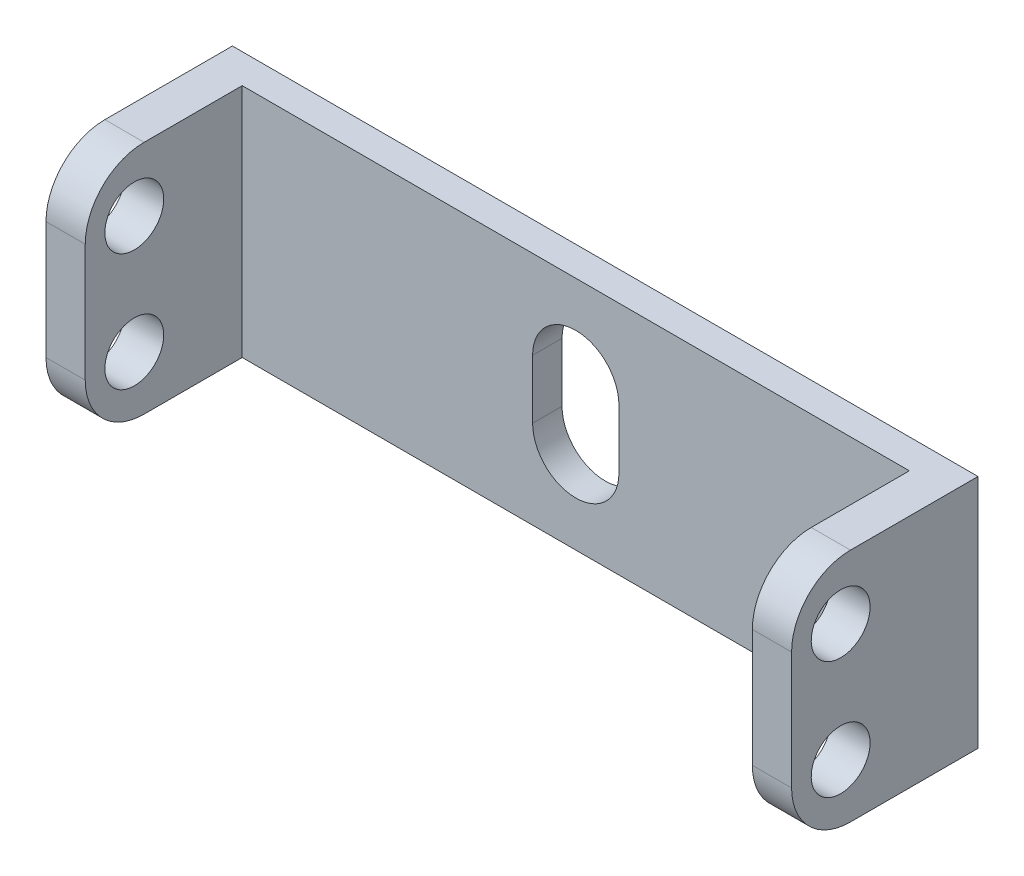
ISO-10303-21;
HEADER;
FILE_DESCRIPTION(('STEP AP214'),'2;1');
FILE_NAME('part.step','',(''),(''),'','','');
FILE_SCHEMA(('AUTOMOTIVE_DESIGN { 1 0 10303 214 1 1 1 1 }'));
ENDSEC;
DATA;
#1=APPLICATION_CONTEXT('core data for automotive mechanical design processes');
#2=APPLICATION_PROTOCOL_DEFINITION('international standard','automotive_design',2000,#1);
#3=PRODUCT_CONTEXT('',#1,'mechanical');
#4=PRODUCT('Part','Part','',(#3));
#5=PRODUCT_RELATED_PRODUCT_CATEGORY('part','',(#4));
#6=PRODUCT_DEFINITION_FORMATION('','',#4);
#7=PRODUCT_DEFINITION_CONTEXT('part definition',#1,'design');
#8=PRODUCT_DEFINITION('design','',#6,#7);
#9=PRODUCT_DEFINITION_SHAPE('','',#8);
#10=(LENGTH_UNIT() NAMED_UNIT(*) SI_UNIT(.MILLI.,.METRE.));
#11=(NAMED_UNIT(*) PLANE_ANGLE_UNIT() SI_UNIT($,.RADIAN.));
#12=(NAMED_UNIT(*) SI_UNIT($,.STERADIAN.) SOLID_ANGLE_UNIT());
#13=UNCERTAINTY_MEASURE_WITH_UNIT(LENGTH_MEASURE(1.E-05),#10,'distance_accuracy_value','');
#14=(GEOMETRIC_REPRESENTATION_CONTEXT(3) GLOBAL_UNCERTAINTY_ASSIGNED_CONTEXT((#13)) GLOBAL_UNIT_ASSIGNED_CONTEXT((#10,
#11,#12)) REPRESENTATION_CONTEXT('',''));
#15=CARTESIAN_POINT('',(0.,0.,0.));
#16=DIRECTION('',(0.,0.,1.));
#17=DIRECTION('',(1.,0.,0.));
#18=AXIS2_PLACEMENT_3D('',#15,#16,#17);
#19=CARTESIAN_POINT('',(-19.,-6.,1.5));
#20=DIRECTION('',(0.,0.,1.));
#21=DIRECTION('',(1.,0.,0.));
#22=AXIS2_PLACEMENT_3D('',#19,#20,#21);
#23=PLANE('',#22);
#24=CARTESIAN_POINT('',(0.,1.5,1.5));
#25=DIRECTION('',(0.,0.,1.));
#26=DIRECTION('',(1.,0.,0.));
#27=AXIS2_PLACEMENT_3D('',#24,#25,#26);
#28=CIRCLE('',#27,2.2);
#29=CARTESIAN_POINT('',(2.2,1.5,1.5));
#30=VERTEX_POINT('',#29);
#31=CARTESIAN_POINT('',(-2.2,1.5,1.5));
#32=VERTEX_POINT('',#31);
#33=EDGE_CURVE('E47',#30,#32,#28,.T.);
#34=ORIENTED_EDGE('',*,*,#33,.F.);
#35=DIRECTION('',(0.,1.,0.));
#36=VECTOR('',#35,1.);
#37=CARTESIAN_POINT('',(2.2,1.5,1.5));
#38=LINE('',#37,#36);
#39=CARTESIAN_POINT('',(2.2,-1.5,1.5));
#40=VERTEX_POINT('',#39);
#41=EDGE_CURVE('E162',#40,#30,#38,.T.);
#42=ORIENTED_EDGE('',*,*,#41,.F.);
#43=CARTESIAN_POINT('',(0.,-1.5,1.5));
#44=DIRECTION('',(0.,0.,1.));
#45=DIRECTION('',(-1.,0.,0.));
#46=AXIS2_PLACEMENT_3D('',#43,#44,#45);
#47=CIRCLE('',#46,2.2);
#48=CARTESIAN_POINT('',(-2.2,-1.5,1.5));
#49=VERTEX_POINT('',#48);
#50=EDGE_CURVE('E147',#49,#40,#47,.T.);
#51=ORIENTED_EDGE('',*,*,#50,.F.);
#52=DIRECTION('',(0.,-1.,0.));
#53=VECTOR('',#52,1.);
#54=CARTESIAN_POINT('',(-2.2,1.5,1.5));
#55=LINE('',#54,#53);
#56=EDGE_CURVE('E156',#32,#49,#55,.T.);
#57=ORIENTED_EDGE('',*,*,#56,.F.);
#58=EDGE_LOOP('',(#34,#42,#51,#57));
#59=FACE_BOUND('',#58,.T.);
#60=DIRECTION('',(1.,0.,0.));
#61=VECTOR('',#60,1.);
#62=CARTESIAN_POINT('',(-19.,-6.,1.5));
#63=LINE('',#62,#61);
#64=CARTESIAN_POINT('',(-17.,-6.,1.5));
#65=VERTEX_POINT('',#64);
#66=CARTESIAN_POINT('',(17.,-6.,1.5));
#67=VERTEX_POINT('',#66);
#68=EDGE_CURVE('E223',#65,#67,#63,.T.);
#69=ORIENTED_EDGE('',*,*,#68,.T.);
#70=DIRECTION('',(0.,-1.,0.));
#71=VECTOR('',#70,1.);
#72=CARTESIAN_POINT('',(17.,6.,1.5));
#73=LINE('',#72,#71);
#74=CARTESIAN_POINT('',(17.,6.,1.5));
#75=VERTEX_POINT('',#74);
#76=EDGE_CURVE('E194',#75,#67,#73,.T.);
#77=ORIENTED_EDGE('',*,*,#76,.F.);
#78=DIRECTION('',(-1.,0.,0.));
#79=VECTOR('',#78,1.);
#80=CARTESIAN_POINT('',(-19.,6.,1.5));
#81=LINE('',#80,#79);
#82=CARTESIAN_POINT('',(-17.,6.,1.5));
#83=VERTEX_POINT('',#82);
#84=EDGE_CURVE('E277',#75,#83,#81,.T.);
#85=ORIENTED_EDGE('',*,*,#84,.T.);
#86=DIRECTION('',(0.,1.,0.));
#87=VECTOR('',#86,1.);
#88=CARTESIAN_POINT('',(-17.,6.,1.5));
#89=LINE('',#88,#87);
#90=EDGE_CURVE('E207',#65,#83,#89,.T.);
#91=ORIENTED_EDGE('',*,*,#90,.F.);
#92=EDGE_LOOP('',(#69,#77,#85,#91));
#93=FACE_BOUND('',#92,.T.);
#94=ADVANCED_FACE('F32',(#59,#93),#23,.T.);
#95=CARTESIAN_POINT('',(-19.,6.,1.5));
#96=DIRECTION('',(1.,0.,0.));
#97=DIRECTION('',(0.,0.,-1.));
#98=AXIS2_PLACEMENT_3D('',#95,#96,#97);
#99=PLANE('',#98);
#100=CARTESIAN_POINT('',(-19.,-3.00000000000002,7.));
#101=DIRECTION('',(1.,0.,0.));
#102=DIRECTION('',(0.,0.,-1.));
#103=AXIS2_PLACEMENT_3D('',#100,#101,#102);
#104=CIRCLE('',#103,1.5);
#105=CARTESIAN_POINT('',(-19.,-3.00000000000002,5.5));
#106=VERTEX_POINT('',#105);
#107=EDGE_CURVE('E177',#106,#106,#104,.F.);
#108=ORIENTED_EDGE('',*,*,#107,.F.);
#109=EDGE_LOOP('',(#108));
#110=FACE_BOUND('',#109,.T.);
#111=CARTESIAN_POINT('',(-19.,2.99999999999998,7.));
#112=DIRECTION('',(1.,0.,0.));
#113=DIRECTION('',(0.,0.,-1.));
#114=AXIS2_PLACEMENT_3D('',#111,#112,#113);
#115=CIRCLE('',#114,1.5);
#116=CARTESIAN_POINT('',(-19.,2.99999999999998,5.5));
#117=VERTEX_POINT('',#116);
#118=EDGE_CURVE('E187',#117,#117,#115,.F.);
#119=ORIENTED_EDGE('',*,*,#118,.F.);
#120=EDGE_LOOP('',(#119));
#121=FACE_BOUND('',#120,.T.);
#122=DIRECTION('',(0.,0.,-1.));
#123=VECTOR('',#122,1.);
#124=CARTESIAN_POINT('',(-19.,-6.,1.5));
#125=LINE('',#124,#123);
#126=CARTESIAN_POINT('',(-19.,-6.,6.5));
#127=VERTEX_POINT('',#126);
#128=CARTESIAN_POINT('',(-19.,-6.,0.));
#129=VERTEX_POINT('',#128);
#130=EDGE_CURVE('E309',#127,#129,#125,.T.);
#131=ORIENTED_EDGE('',*,*,#130,.F.);
#132=CARTESIAN_POINT('',(-19.,-3.,6.5));
#133=DIRECTION('',(1.,0.,0.));
#134=DIRECTION('',(0.,0.,-1.));
#135=AXIS2_PLACEMENT_3D('',#132,#133,#134);
#136=CIRCLE('',#135,3.);
#137=CARTESIAN_POINT('',(-19.,-3.,9.5));
#138=VERTEX_POINT('',#137);
#139=EDGE_CURVE('E11',#127,#138,#136,.F.);
#140=ORIENTED_EDGE('',*,*,#139,.T.);
#141=DIRECTION('',(0.,-1.,0.));
#142=VECTOR('',#141,1.);
#143=CARTESIAN_POINT('',(-19.,6.,9.5));
#144=LINE('',#143,#142);
#145=CARTESIAN_POINT('',(-19.,3.,9.5));
#146=VERTEX_POINT('',#145);
#147=EDGE_CURVE('E208',#146,#138,#144,.T.);
#148=ORIENTED_EDGE('',*,*,#147,.F.);
#149=CARTESIAN_POINT('',(-19.,3.,6.5));
#150=DIRECTION('',(1.,0.,0.));
#151=DIRECTION('',(0.,0.,-1.));
#152=AXIS2_PLACEMENT_3D('',#149,#150,#151);
#153=CIRCLE('',#152,3.);
#154=CARTESIAN_POINT('',(-19.,6.,6.5));
#155=VERTEX_POINT('',#154);
#156=EDGE_CURVE('E40',#146,#155,#153,.F.);
#157=ORIENTED_EDGE('',*,*,#156,.T.);
#158=DIRECTION('',(0.,0.,-1.));
#159=VECTOR('',#158,1.);
#160=CARTESIAN_POINT('',(-19.,6.,1.5));
#161=LINE('',#160,#159);
#162=CARTESIAN_POINT('',(-19.,6.,0.));
#163=VERTEX_POINT('',#162);
#164=EDGE_CURVE('E264',#155,#163,#161,.T.);
#165=ORIENTED_EDGE('',*,*,#164,.T.);
#166=DIRECTION('',(0.,-1.,0.));
#167=VECTOR('',#166,1.);
#168=CARTESIAN_POINT('',(-19.,6.,0.));
#169=LINE('',#168,#167);
#170=EDGE_CURVE('E245',#163,#129,#169,.T.);
#171=ORIENTED_EDGE('',*,*,#170,.T.);
#172=EDGE_LOOP('',(#131,#140,#148,#157,#165,#171));
#173=FACE_BOUND('',#172,.T.);
#174=ADVANCED_FACE('F262',(#110,#121,#173),#99,.F.);
#175=CARTESIAN_POINT('',(-19.,-6.,1.5));
#176=DIRECTION('',(0.,1.,0.));
#177=DIRECTION('',(0.,0.,1.));
#178=AXIS2_PLACEMENT_3D('',#175,#176,#177);
#179=PLANE('',#178);
#180=DIRECTION('',(0.,0.,-1.));
#181=VECTOR('',#180,1.);
#182=CARTESIAN_POINT('',(19.,-6.,1.5));
#183=LINE('',#182,#181);
#184=CARTESIAN_POINT('',(19.,-6.,6.5));
#185=VERTEX_POINT('',#184);
#186=CARTESIAN_POINT('',(19.,-6.,0.));
#187=VERTEX_POINT('',#186);
#188=EDGE_CURVE('E308',#185,#187,#183,.T.);
#189=ORIENTED_EDGE('',*,*,#188,.F.);
#190=DIRECTION('',(1.,0.,0.));
#191=VECTOR('',#190,1.);
#192=CARTESIAN_POINT('',(-19.,-6.,6.5));
#193=LINE('',#192,#191);
#194=CARTESIAN_POINT('',(17.,-6.,6.5));
#195=VERTEX_POINT('',#194);
#196=EDGE_CURVE('E247',#185,#195,#193,.F.);
#197=ORIENTED_EDGE('',*,*,#196,.T.);
#198=DIRECTION('',(0.,0.,-1.));
#199=VECTOR('',#198,1.);
#200=CARTESIAN_POINT('',(17.,-6.,9.5));
#201=LINE('',#200,#199);
#202=EDGE_CURVE('E201',#195,#67,#201,.T.);
#203=ORIENTED_EDGE('',*,*,#202,.T.);
#204=ORIENTED_EDGE('',*,*,#68,.F.);
#205=DIRECTION('',(0.,0.,-1.));
#206=VECTOR('',#205,1.);
#207=CARTESIAN_POINT('',(-17.,-6.,9.5));
#208=LINE('',#207,#206);
#209=CARTESIAN_POINT('',(-17.,-6.,6.5));
#210=VERTEX_POINT('',#209);
#211=EDGE_CURVE('E232',#210,#65,#208,.T.);
#212=ORIENTED_EDGE('',*,*,#211,.F.);
#213=DIRECTION('',(1.,0.,0.));
#214=VECTOR('',#213,1.);
#215=CARTESIAN_POINT('',(-19.,-6.,6.5));
#216=LINE('',#215,#214);
#217=EDGE_CURVE('E243',#210,#127,#216,.F.);
#218=ORIENTED_EDGE('',*,*,#217,.T.);
#219=ORIENTED_EDGE('',*,*,#130,.T.);
#220=DIRECTION('',(1.,0.,0.));
#221=VECTOR('',#220,1.);
#222=CARTESIAN_POINT('',(-19.,-6.,0.));
#223=LINE('',#222,#221);
#224=EDGE_CURVE('E303',#129,#187,#223,.T.);
#225=ORIENTED_EDGE('',*,*,#224,.T.);
#226=EDGE_LOOP('',(#189,#197,#203,#204,#212,#218,#219,#225));
#227=FACE_BOUND('',#226,.T.);
#228=ADVANCED_FACE('F295',(#227),#179,.F.);
#229=CARTESIAN_POINT('',(19.,6.,1.5));
#230=DIRECTION('',(-1.,0.,0.));
#231=DIRECTION('',(0.,-1.,0.));
#232=AXIS2_PLACEMENT_3D('',#229,#230,#231);
#233=PLANE('',#232);
#234=CARTESIAN_POINT('',(19.,-3.,7.));
#235=DIRECTION('',(1.,0.,0.));
#236=DIRECTION('',(0.,1.,0.));
#237=AXIS2_PLACEMENT_3D('',#234,#235,#236);
#238=CIRCLE('',#237,1.5);
#239=CARTESIAN_POINT('',(19.,-1.5,7.));
#240=VERTEX_POINT('',#239);
#241=EDGE_CURVE('E173',#240,#240,#238,.T.);
#242=ORIENTED_EDGE('',*,*,#241,.F.);
#243=EDGE_LOOP('',(#242));
#244=FACE_BOUND('',#243,.T.);
#245=CARTESIAN_POINT('',(19.,3.,7.));
#246=DIRECTION('',(1.,0.,0.));
#247=DIRECTION('',(0.,1.,0.));
#248=AXIS2_PLACEMENT_3D('',#245,#246,#247);
#249=CIRCLE('',#248,1.5);
#250=CARTESIAN_POINT('',(19.,4.5,7.));
#251=VERTEX_POINT('',#250);
#252=EDGE_CURVE('E184',#251,#251,#249,.T.);
#253=ORIENTED_EDGE('',*,*,#252,.F.);
#254=EDGE_LOOP('',(#253));
#255=FACE_BOUND('',#254,.T.);
#256=DIRECTION('',(0.,0.,-1.));
#257=VECTOR('',#256,1.);
#258=CARTESIAN_POINT('',(19.,6.,1.5));
#259=LINE('',#258,#257);
#260=CARTESIAN_POINT('',(19.,6.,6.5));
#261=VERTEX_POINT('',#260);
#262=CARTESIAN_POINT('',(19.,6.,0.));
#263=VERTEX_POINT('',#262);
#264=EDGE_CURVE('E276',#261,#263,#259,.T.);
#265=ORIENTED_EDGE('',*,*,#264,.F.);
#266=CARTESIAN_POINT('',(19.,3.,6.5));
#267=DIRECTION('',(-1.,0.,0.));
#268=DIRECTION('',(0.,-1.,0.));
#269=AXIS2_PLACEMENT_3D('',#266,#267,#268);
#270=CIRCLE('',#269,3.);
#271=CARTESIAN_POINT('',(19.,3.,9.5));
#272=VERTEX_POINT('',#271);
#273=EDGE_CURVE('E241',#261,#272,#270,.F.);
#274=ORIENTED_EDGE('',*,*,#273,.T.);
#275=DIRECTION('',(0.,1.,0.));
#276=VECTOR('',#275,1.);
#277=CARTESIAN_POINT('',(19.,6.,9.5));
#278=LINE('',#277,#276);
#279=CARTESIAN_POINT('',(19.,-3.,9.5));
#280=VERTEX_POINT('',#279);
#281=EDGE_CURVE('E195',#280,#272,#278,.T.);
#282=ORIENTED_EDGE('',*,*,#281,.F.);
#283=CARTESIAN_POINT('',(19.,-3.,6.5));
#284=DIRECTION('',(-1.,0.,0.));
#285=DIRECTION('',(0.,-1.,0.));
#286=AXIS2_PLACEMENT_3D('',#283,#284,#285);
#287=CIRCLE('',#286,3.);
#288=EDGE_CURVE('E239',#280,#185,#287,.F.);
#289=ORIENTED_EDGE('',*,*,#288,.T.);
#290=ORIENTED_EDGE('',*,*,#188,.T.);
#291=DIRECTION('',(0.,1.,0.));
#292=VECTOR('',#291,1.);
#293=CARTESIAN_POINT('',(19.,6.,0.));
#294=LINE('',#293,#292);
#295=EDGE_CURVE('E300',#187,#263,#294,.T.);
#296=ORIENTED_EDGE('',*,*,#295,.T.);
#297=EDGE_LOOP('',(#265,#274,#282,#289,#290,#296));
#298=FACE_BOUND('',#297,.T.);
#299=ADVANCED_FACE('F336',(#244,#255,#298),#233,.F.);
#300=CARTESIAN_POINT('',(-19.,6.,1.5));
#301=DIRECTION('',(0.,-1.,0.));
#302=DIRECTION('',(1.,0.,0.));
#303=AXIS2_PLACEMENT_3D('',#300,#301,#302);
#304=PLANE('',#303);
#305=DIRECTION('',(0.,0.,-1.));
#306=VECTOR('',#305,1.);
#307=CARTESIAN_POINT('',(17.,6.,9.5));
#308=LINE('',#307,#306);
#309=CARTESIAN_POINT('',(17.,6.,6.5));
#310=VERTEX_POINT('',#309);
#311=EDGE_CURVE('E205',#310,#75,#308,.T.);
#312=ORIENTED_EDGE('',*,*,#311,.F.);
#313=DIRECTION('',(-1.,0.,0.));
#314=VECTOR('',#313,1.);
#315=CARTESIAN_POINT('',(-19.,6.,6.5));
#316=LINE('',#315,#314);
#317=EDGE_CURVE('E237',#310,#261,#316,.F.);
#318=ORIENTED_EDGE('',*,*,#317,.T.);
#319=ORIENTED_EDGE('',*,*,#264,.T.);
#320=DIRECTION('',(-1.,0.,0.));
#321=VECTOR('',#320,1.);
#322=CARTESIAN_POINT('',(-19.,6.,0.));
#323=LINE('',#322,#321);
#324=EDGE_CURVE('E274',#263,#163,#323,.T.);
#325=ORIENTED_EDGE('',*,*,#324,.T.);
#326=ORIENTED_EDGE('',*,*,#164,.F.);
#327=DIRECTION('',(-1.,0.,0.));
#328=VECTOR('',#327,1.);
#329=CARTESIAN_POINT('',(-17.,6.,6.5));
#330=LINE('',#329,#328);
#331=CARTESIAN_POINT('',(-17.,6.,6.5));
#332=VERTEX_POINT('',#331);
#333=EDGE_CURVE('E235',#155,#332,#330,.F.);
#334=ORIENTED_EDGE('',*,*,#333,.T.);
#335=DIRECTION('',(0.,0.,-1.));
#336=VECTOR('',#335,1.);
#337=CARTESIAN_POINT('',(-17.,6.,9.5));
#338=LINE('',#337,#336);
#339=EDGE_CURVE('E214',#332,#83,#338,.T.);
#340=ORIENTED_EDGE('',*,*,#339,.T.);
#341=ORIENTED_EDGE('',*,*,#84,.F.);
#342=EDGE_LOOP('',(#312,#318,#319,#325,#326,#334,#340,#341));
#343=FACE_BOUND('',#342,.T.);
#344=ADVANCED_FACE('F271',(#343),#304,.F.);
#345=CARTESIAN_POINT('',(-19.,-6.,0.));
#346=DIRECTION('',(0.,0.,1.));
#347=DIRECTION('',(1.,0.,0.));
#348=AXIS2_PLACEMENT_3D('',#345,#346,#347);
#349=PLANE('',#348);
#350=DIRECTION('',(0.,-1.,0.));
#351=VECTOR('',#350,1.);
#352=CARTESIAN_POINT('',(2.2,1.5,0.));
#353=LINE('',#352,#351);
#354=CARTESIAN_POINT('',(2.2,1.5,0.));
#355=VERTEX_POINT('',#354);
#356=CARTESIAN_POINT('',(2.2,-1.5,0.));
#357=VERTEX_POINT('',#356);
#358=EDGE_CURVE('E573',#355,#357,#353,.T.);
#359=ORIENTED_EDGE('',*,*,#358,.F.);
#360=CARTESIAN_POINT('',(0.,1.5,0.));
#361=DIRECTION('',(0.,0.,1.));
#362=DIRECTION('',(1.,0.,0.));
#363=AXIS2_PLACEMENT_3D('',#360,#361,#362);
#364=CIRCLE('',#363,2.2);
#365=CARTESIAN_POINT('',(-2.2,1.5,0.));
#366=VERTEX_POINT('',#365);
#367=EDGE_CURVE('E174',#366,#355,#364,.F.);
#368=ORIENTED_EDGE('',*,*,#367,.F.);
#369=DIRECTION('',(0.,1.,0.));
#370=VECTOR('',#369,1.);
#371=CARTESIAN_POINT('',(-2.2,1.5,0.));
#372=LINE('',#371,#370);
#373=CARTESIAN_POINT('',(-2.2,-1.5,0.));
#374=VERTEX_POINT('',#373);
#375=EDGE_CURVE('E171',#374,#366,#372,.T.);
#376=ORIENTED_EDGE('',*,*,#375,.F.);
#377=CARTESIAN_POINT('',(0.,-1.5,0.));
#378=DIRECTION('',(0.,0.,1.));
#379=DIRECTION('',(1.,0.,0.));
#380=AXIS2_PLACEMENT_3D('',#377,#378,#379);
#381=CIRCLE('',#380,2.2);
#382=EDGE_CURVE('E150',#357,#374,#381,.F.);
#383=ORIENTED_EDGE('',*,*,#382,.F.);
#384=EDGE_LOOP('',(#359,#368,#376,#383));
#385=FACE_BOUND('',#384,.T.);
#386=ORIENTED_EDGE('',*,*,#170,.F.);
#387=ORIENTED_EDGE('',*,*,#324,.F.);
#388=ORIENTED_EDGE('',*,*,#295,.F.);
#389=ORIENTED_EDGE('',*,*,#224,.F.);
#390=EDGE_LOOP('',(#386,#387,#388,#389));
#391=FACE_BOUND('',#390,.T.);
#392=ADVANCED_FACE('F343',(#385,#391),#349,.F.);
#393=CARTESIAN_POINT('',(-17.,6.,9.5));
#394=DIRECTION('',(-1.,0.,0.));
#395=DIRECTION('',(0.,0.,1.));
#396=AXIS2_PLACEMENT_3D('',#393,#394,#395);
#397=PLANE('',#396);
#398=CARTESIAN_POINT('',(-17.,-3.00000000000002,7.));
#399=DIRECTION('',(-1.,0.,0.));
#400=DIRECTION('',(0.,0.,1.));
#401=AXIS2_PLACEMENT_3D('',#398,#399,#400);
#402=CIRCLE('',#401,1.5);
#403=CARTESIAN_POINT('',(-17.,-3.00000000000002,8.5));
#404=VERTEX_POINT('',#403);
#405=EDGE_CURVE('E181',#404,#404,#402,.T.);
#406=ORIENTED_EDGE('',*,*,#405,.T.);
#407=EDGE_LOOP('',(#406));
#408=FACE_BOUND('',#407,.T.);
#409=CARTESIAN_POINT('',(-17.,2.99999999999998,7.));
#410=DIRECTION('',(-1.,0.,0.));
#411=DIRECTION('',(0.,0.,1.));
#412=AXIS2_PLACEMENT_3D('',#409,#410,#411);
#413=CIRCLE('',#412,1.5);
#414=CARTESIAN_POINT('',(-17.,2.99999999999998,8.5));
#415=VERTEX_POINT('',#414);
#416=EDGE_CURVE('E191',#415,#415,#413,.T.);
#417=ORIENTED_EDGE('',*,*,#416,.T.);
#418=EDGE_LOOP('',(#417));
#419=FACE_BOUND('',#418,.T.);
#420=DIRECTION('',(0.,1.,0.));
#421=VECTOR('',#420,1.);
#422=CARTESIAN_POINT('',(-17.,6.,9.5));
#423=LINE('',#422,#421);
#424=CARTESIAN_POINT('',(-17.,-3.,9.5));
#425=VERTEX_POINT('',#424);
#426=CARTESIAN_POINT('',(-17.,3.,9.5));
#427=VERTEX_POINT('',#426);
#428=EDGE_CURVE('E211',#425,#427,#423,.T.);
#429=ORIENTED_EDGE('',*,*,#428,.F.);
#430=CARTESIAN_POINT('',(-17.,-3.,6.5));
#431=DIRECTION('',(-1.,0.,0.));
#432=DIRECTION('',(0.,0.,1.));
#433=AXIS2_PLACEMENT_3D('',#430,#431,#432);
#434=CIRCLE('',#433,3.);
#435=EDGE_CURVE('E257',#425,#210,#434,.F.);
#436=ORIENTED_EDGE('',*,*,#435,.T.);
#437=ORIENTED_EDGE('',*,*,#211,.T.);
#438=ORIENTED_EDGE('',*,*,#90,.T.);
#439=ORIENTED_EDGE('',*,*,#339,.F.);
#440=CARTESIAN_POINT('',(-17.,3.,6.5));
#441=DIRECTION('',(-1.,0.,0.));
#442=DIRECTION('',(0.,0.,1.));
#443=AXIS2_PLACEMENT_3D('',#440,#441,#442);
#444=CIRCLE('',#443,3.);
#445=EDGE_CURVE('E255',#332,#427,#444,.F.);
#446=ORIENTED_EDGE('',*,*,#445,.T.);
#447=EDGE_LOOP('',(#429,#436,#437,#438,#439,#446));
#448=FACE_BOUND('',#447,.T.);
#449=ADVANCED_FACE('F282',(#408,#419,#448),#397,.F.);
#450=CARTESIAN_POINT('',(-19.,-6.,9.5));
#451=DIRECTION('',(0.,0.,1.));
#452=DIRECTION('',(1.,0.,0.));
#453=AXIS2_PLACEMENT_3D('',#450,#451,#452);
#454=PLANE('',#453);
#455=ORIENTED_EDGE('',*,*,#147,.T.);
#456=DIRECTION('',(1.,0.,0.));
#457=VECTOR('',#456,1.);
#458=CARTESIAN_POINT('',(-17.,-3.,9.5));
#459=LINE('',#458,#457);
#460=EDGE_CURVE('E252',#138,#425,#459,.T.);
#461=ORIENTED_EDGE('',*,*,#460,.T.);
#462=ORIENTED_EDGE('',*,*,#428,.T.);
#463=DIRECTION('',(-1.,0.,0.));
#464=VECTOR('',#463,1.);
#465=CARTESIAN_POINT('',(-19.,3.,9.5));
#466=LINE('',#465,#464);
#467=EDGE_CURVE('E249',#427,#146,#466,.T.);
#468=ORIENTED_EDGE('',*,*,#467,.T.);
#469=EDGE_LOOP('',(#455,#461,#462,#468));
#470=FACE_BOUND('',#469,.T.);
#471=ADVANCED_FACE('F284',(#470),#454,.T.);
#472=CARTESIAN_POINT('',(17.,6.,9.5));
#473=DIRECTION('',(1.,0.,0.));
#474=DIRECTION('',(0.,0.,-1.));
#475=AXIS2_PLACEMENT_3D('',#472,#473,#474);
#476=PLANE('',#475);
#477=CARTESIAN_POINT('',(17.,-3.,7.));
#478=DIRECTION('',(1.,0.,0.));
#479=DIRECTION('',(0.,0.,-1.));
#480=AXIS2_PLACEMENT_3D('',#477,#478,#479);
#481=CIRCLE('',#480,1.5);
#482=CARTESIAN_POINT('',(17.,-3.,5.5));
#483=VERTEX_POINT('',#482);
#484=EDGE_CURVE('E180',#483,#483,#481,.T.);
#485=ORIENTED_EDGE('',*,*,#484,.T.);
#486=EDGE_LOOP('',(#485));
#487=FACE_BOUND('',#486,.T.);
#488=CARTESIAN_POINT('',(17.,3.,7.));
#489=DIRECTION('',(1.,0.,0.));
#490=DIRECTION('',(0.,0.,-1.));
#491=AXIS2_PLACEMENT_3D('',#488,#489,#490);
#492=CIRCLE('',#491,1.5);
#493=CARTESIAN_POINT('',(17.,3.,5.5));
#494=VERTEX_POINT('',#493);
#495=EDGE_CURVE('E190',#494,#494,#492,.T.);
#496=ORIENTED_EDGE('',*,*,#495,.T.);
#497=EDGE_LOOP('',(#496));
#498=FACE_BOUND('',#497,.T.);
#499=DIRECTION('',(0.,-1.,0.));
#500=VECTOR('',#499,1.);
#501=CARTESIAN_POINT('',(17.,6.,9.5));
#502=LINE('',#501,#500);
#503=CARTESIAN_POINT('',(17.,3.,9.5));
#504=VERTEX_POINT('',#503);
#505=CARTESIAN_POINT('',(17.,-3.,9.5));
#506=VERTEX_POINT('',#505);
#507=EDGE_CURVE('E198',#504,#506,#502,.T.);
#508=ORIENTED_EDGE('',*,*,#507,.F.);
#509=CARTESIAN_POINT('',(17.,3.,6.5));
#510=DIRECTION('',(1.,0.,0.));
#511=DIRECTION('',(0.,0.,-1.));
#512=AXIS2_PLACEMENT_3D('',#509,#510,#511);
#513=CIRCLE('',#512,3.);
#514=EDGE_CURVE('E233',#504,#310,#513,.F.);
#515=ORIENTED_EDGE('',*,*,#514,.T.);
#516=ORIENTED_EDGE('',*,*,#311,.T.);
#517=ORIENTED_EDGE('',*,*,#76,.T.);
#518=ORIENTED_EDGE('',*,*,#202,.F.);
#519=CARTESIAN_POINT('',(17.,-3.,6.5));
#520=DIRECTION('',(1.,0.,0.));
#521=DIRECTION('',(0.,0.,-1.));
#522=AXIS2_PLACEMENT_3D('',#519,#520,#521);
#523=CIRCLE('',#522,3.);
#524=EDGE_CURVE('E320',#195,#506,#523,.F.);
#525=ORIENTED_EDGE('',*,*,#524,.T.);
#526=EDGE_LOOP('',(#508,#515,#516,#517,#518,#525));
#527=FACE_BOUND('',#526,.T.);
#528=ADVANCED_FACE('F327',(#487,#498,#527),#476,.F.);
#529=CARTESIAN_POINT('',(19.,-6.,9.5));
#530=DIRECTION('',(0.,0.,-1.));
#531=DIRECTION('',(-1.,0.,0.));
#532=AXIS2_PLACEMENT_3D('',#529,#530,#531);
#533=PLANE('',#532);
#534=ORIENTED_EDGE('',*,*,#281,.T.);
#535=DIRECTION('',(-1.,0.,0.));
#536=VECTOR('',#535,1.);
#537=CARTESIAN_POINT('',(19.,3.,9.5));
#538=LINE('',#537,#536);
#539=EDGE_CURVE('E314',#272,#504,#538,.T.);
#540=ORIENTED_EDGE('',*,*,#539,.T.);
#541=ORIENTED_EDGE('',*,*,#507,.T.);
#542=DIRECTION('',(1.,0.,0.));
#543=VECTOR('',#542,1.);
#544=CARTESIAN_POINT('',(19.,-3.,9.5));
#545=LINE('',#544,#543);
#546=EDGE_CURVE('E310',#506,#280,#545,.T.);
#547=ORIENTED_EDGE('',*,*,#546,.T.);
#548=EDGE_LOOP('',(#534,#540,#541,#547));
#549=FACE_BOUND('',#548,.T.);
#550=ADVANCED_FACE('F337',(#549),#533,.F.);
#551=CARTESIAN_POINT('',(-23.2426406871193,2.99999999999998,7.));
#552=DIRECTION('',(1.,0.,0.));
#553=DIRECTION('',(0.,1.,0.));
#554=AXIS2_PLACEMENT_3D('',#551,#552,#553);
#555=CYLINDRICAL_SURFACE('',#554,1.5);
#556=ORIENTED_EDGE('',*,*,#252,.T.);
#557=EDGE_LOOP('',(#556));
#558=FACE_BOUND('',#557,.T.);
#559=ORIENTED_EDGE('',*,*,#495,.F.);
#560=EDGE_LOOP('',(#559));
#561=FACE_BOUND('',#560,.T.);
#562=ADVANCED_FACE('F350',(#558,#561),#555,.F.);
#563=ORIENTED_EDGE('',*,*,#118,.T.);
#564=EDGE_LOOP('',(#563));
#565=FACE_BOUND('',#564,.T.);
#566=ORIENTED_EDGE('',*,*,#416,.F.);
#567=EDGE_LOOP('',(#566));
#568=FACE_BOUND('',#567,.T.);
#569=ADVANCED_FACE('F352',(#565,#568),#555,.F.);
#570=CARTESIAN_POINT('',(-23.2426406871193,-3.00000000000003,7.));
#571=DIRECTION('',(1.,0.,0.));
#572=DIRECTION('',(0.,1.,0.));
#573=AXIS2_PLACEMENT_3D('',#570,#571,#572);
#574=CYLINDRICAL_SURFACE('',#573,1.5);
#575=ORIENTED_EDGE('',*,*,#241,.T.);
#576=EDGE_LOOP('',(#575));
#577=FACE_BOUND('',#576,.T.);
#578=ORIENTED_EDGE('',*,*,#484,.F.);
#579=EDGE_LOOP('',(#578));
#580=FACE_BOUND('',#579,.T.);
#581=ADVANCED_FACE('F359',(#577,#580),#574,.F.);
#582=ORIENTED_EDGE('',*,*,#107,.T.);
#583=EDGE_LOOP('',(#582));
#584=FACE_BOUND('',#583,.T.);
#585=ORIENTED_EDGE('',*,*,#405,.F.);
#586=EDGE_LOOP('',(#585));
#587=FACE_BOUND('',#586,.T.);
#588=ADVANCED_FACE('F385',(#584,#587),#574,.F.);
#589=CARTESIAN_POINT('',(19.,3.,6.5));
#590=DIRECTION('',(-1.,0.,0.));
#591=DIRECTION('',(0.,-1.,0.));
#592=AXIS2_PLACEMENT_3D('',#589,#590,#591);
#593=CYLINDRICAL_SURFACE('',#592,3.);
#594=ORIENTED_EDGE('',*,*,#273,.F.);
#595=ORIENTED_EDGE('',*,*,#317,.F.);
#596=ORIENTED_EDGE('',*,*,#514,.F.);
#597=ORIENTED_EDGE('',*,*,#539,.F.);
#598=EDGE_LOOP('',(#594,#595,#596,#597));
#599=FACE_BOUND('',#598,.T.);
#600=ADVANCED_FACE('F334',(#599),#593,.T.);
#601=CARTESIAN_POINT('',(19.,-3.,6.5));
#602=DIRECTION('',(1.,0.,0.));
#603=DIRECTION('',(0.,0.,-1.));
#604=AXIS2_PLACEMENT_3D('',#601,#602,#603);
#605=CYLINDRICAL_SURFACE('',#604,3.);
#606=ORIENTED_EDGE('',*,*,#524,.F.);
#607=ORIENTED_EDGE('',*,*,#196,.F.);
#608=ORIENTED_EDGE('',*,*,#288,.F.);
#609=ORIENTED_EDGE('',*,*,#546,.F.);
#610=EDGE_LOOP('',(#606,#607,#608,#609));
#611=FACE_BOUND('',#610,.T.);
#612=ADVANCED_FACE('F339',(#611),#605,.T.);
#613=CARTESIAN_POINT('',(-19.,-3.,6.5));
#614=DIRECTION('',(-1.,0.,0.));
#615=DIRECTION('',(0.,0.,1.));
#616=AXIS2_PLACEMENT_3D('',#613,#614,#615);
#617=CYLINDRICAL_SURFACE('',#616,3.);
#618=ORIENTED_EDGE('',*,*,#139,.F.);
#619=ORIENTED_EDGE('',*,*,#217,.F.);
#620=ORIENTED_EDGE('',*,*,#435,.F.);
#621=ORIENTED_EDGE('',*,*,#460,.F.);
#622=EDGE_LOOP('',(#618,#619,#620,#621));
#623=FACE_BOUND('',#622,.T.);
#624=ADVANCED_FACE('F288',(#623),#617,.T.);
#625=CARTESIAN_POINT('',(-19.,3.,6.5));
#626=DIRECTION('',(1.,0.,0.));
#627=DIRECTION('',(0.,1.,0.));
#628=AXIS2_PLACEMENT_3D('',#625,#626,#627);
#629=CYLINDRICAL_SURFACE('',#628,3.);
#630=ORIENTED_EDGE('',*,*,#445,.F.);
#631=ORIENTED_EDGE('',*,*,#333,.F.);
#632=ORIENTED_EDGE('',*,*,#156,.F.);
#633=ORIENTED_EDGE('',*,*,#467,.F.);
#634=EDGE_LOOP('',(#630,#631,#632,#633));
#635=FACE_BOUND('',#634,.T.);
#636=ADVANCED_FACE('F34',(#635),#629,.T.);
#637=CARTESIAN_POINT('',(0.,1.5,-8.60929730001235));
#638=DIRECTION('',(0.,0.,1.));
#639=DIRECTION('',(1.,0.,0.));
#640=AXIS2_PLACEMENT_3D('',#637,#638,#639);
#641=CYLINDRICAL_SURFACE('',#640,2.2);
#642=ORIENTED_EDGE('',*,*,#367,.T.);
#643=DIRECTION('',(0.,0.,1.));
#644=VECTOR('',#643,1.);
#645=CARTESIAN_POINT('',(2.2,1.5,-8.60929730001235));
#646=LINE('',#645,#644);
#647=EDGE_CURVE('E167',#355,#30,#646,.T.);
#648=ORIENTED_EDGE('',*,*,#647,.T.);
#649=ORIENTED_EDGE('',*,*,#33,.T.);
#650=DIRECTION('',(0.,0.,1.));
#651=VECTOR('',#650,1.);
#652=CARTESIAN_POINT('',(-2.2,1.5,-8.60929730001235));
#653=LINE('',#652,#651);
#654=EDGE_CURVE('E153',#366,#32,#653,.T.);
#655=ORIENTED_EDGE('',*,*,#654,.F.);
#656=EDGE_LOOP('',(#642,#648,#649,#655));
#657=FACE_BOUND('',#656,.T.);
#658=ADVANCED_FACE('F391',(#657),#641,.F.);
#659=CARTESIAN_POINT('',(2.2,1.5,-8.60929730001235));
#660=DIRECTION('',(1.,0.,0.));
#661=DIRECTION('',(0.,1.,0.));
#662=AXIS2_PLACEMENT_3D('',#659,#660,#661);
#663=PLANE('',#662);
#664=ORIENTED_EDGE('',*,*,#358,.T.);
#665=DIRECTION('',(0.,0.,1.));
#666=VECTOR('',#665,1.);
#667=CARTESIAN_POINT('',(2.2,-1.5,-8.60929730001235));
#668=LINE('',#667,#666);
#669=EDGE_CURVE('E152',#357,#40,#668,.T.);
#670=ORIENTED_EDGE('',*,*,#669,.T.);
#671=ORIENTED_EDGE('',*,*,#41,.T.);
#672=ORIENTED_EDGE('',*,*,#647,.F.);
#673=EDGE_LOOP('',(#664,#670,#671,#672));
#674=FACE_BOUND('',#673,.T.);
#675=ADVANCED_FACE('F395',(#674),#663,.F.);
#676=CARTESIAN_POINT('',(0.,-1.5,-8.60929730001235));
#677=DIRECTION('',(0.,0.,1.));
#678=DIRECTION('',(1.,0.,0.));
#679=AXIS2_PLACEMENT_3D('',#676,#677,#678);
#680=CYLINDRICAL_SURFACE('',#679,2.2);
#681=ORIENTED_EDGE('',*,*,#382,.T.);
#682=DIRECTION('',(0.,0.,1.));
#683=VECTOR('',#682,1.);
#684=CARTESIAN_POINT('',(-2.2,-1.5,-8.60929730001235));
#685=LINE('',#684,#683);
#686=EDGE_CURVE('E55',#374,#49,#685,.T.);
#687=ORIENTED_EDGE('',*,*,#686,.T.);
#688=ORIENTED_EDGE('',*,*,#50,.T.);
#689=ORIENTED_EDGE('',*,*,#669,.F.);
#690=EDGE_LOOP('',(#681,#687,#688,#689));
#691=FACE_BOUND('',#690,.T.);
#692=ADVANCED_FACE('F144',(#691),#680,.F.);
#693=CARTESIAN_POINT('',(-2.2,1.5,-8.60929730001235));
#694=DIRECTION('',(-1.,0.,0.));
#695=DIRECTION('',(0.,-1.,0.));
#696=AXIS2_PLACEMENT_3D('',#693,#694,#695);
#697=PLANE('',#696);
#698=ORIENTED_EDGE('',*,*,#375,.T.);
#699=ORIENTED_EDGE('',*,*,#654,.T.);
#700=ORIENTED_EDGE('',*,*,#56,.T.);
#701=ORIENTED_EDGE('',*,*,#686,.F.);
#702=EDGE_LOOP('',(#698,#699,#700,#701));
#703=FACE_BOUND('',#702,.T.);
#704=ADVANCED_FACE('F157',(#703),#697,.F.);
#705=CLOSED_SHELL('',(#94,#174,#228,#299,#344,#392,#449,#471,#528,#550,#562,#569,#581,#588,#600,
#612,#624,#636,#658,#675,#692,#704));
#706=MANIFOLD_SOLID_BREP('B2',#705);
#707=ADVANCED_BREP_SHAPE_REPRESENTATION('',(#18,#706),#14);
#708=SHAPE_DEFINITION_REPRESENTATION(#9,#707);
ENDSEC;
END-ISO-10303-21;
